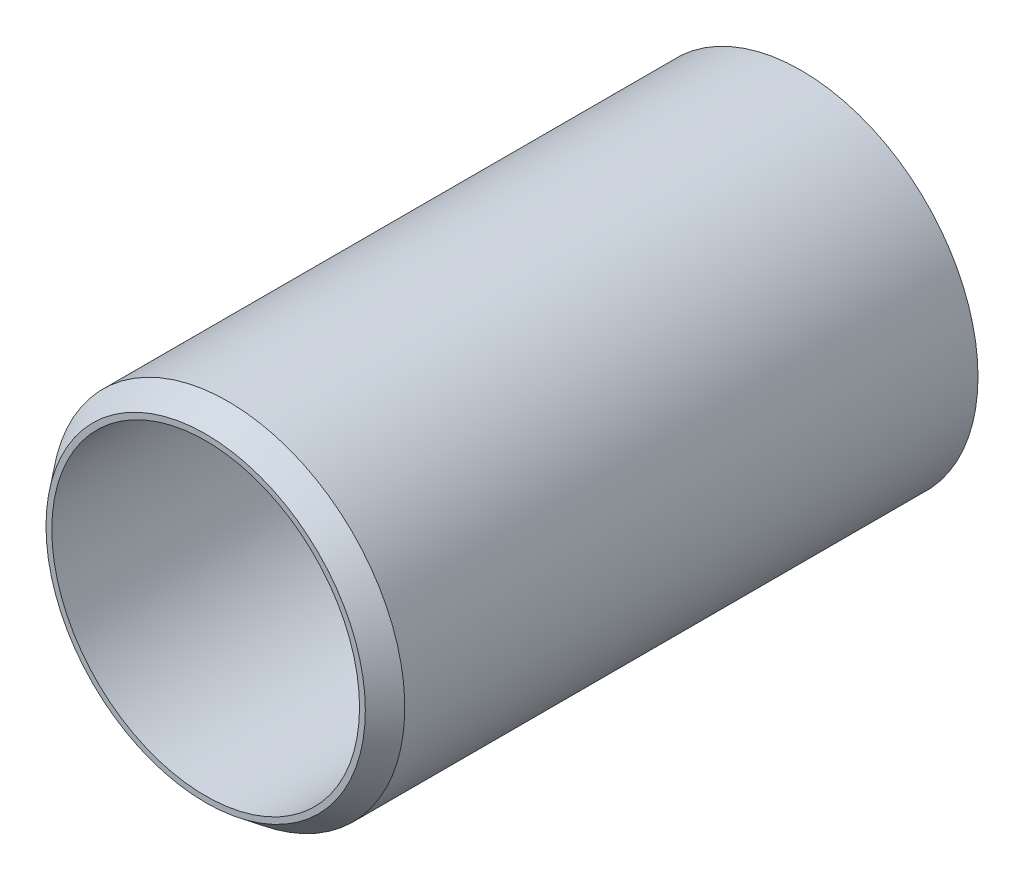
ISO-10303-21;
HEADER;
FILE_DESCRIPTION(('STEP AP214'),'2;1');
FILE_NAME('part.step','',(''),(''),'','','');
FILE_SCHEMA(('AUTOMOTIVE_DESIGN { 1 0 10303 214 1 1 1 1 }'));
ENDSEC;
DATA;
#1=APPLICATION_CONTEXT('core data for automotive mechanical design processes');
#2=APPLICATION_PROTOCOL_DEFINITION('international standard','automotive_design',2000,#1);
#3=PRODUCT_CONTEXT('',#1,'mechanical');
#4=PRODUCT('Part','Part','',(#3));
#5=PRODUCT_RELATED_PRODUCT_CATEGORY('part','',(#4));
#6=PRODUCT_DEFINITION_FORMATION('','',#4);
#7=PRODUCT_DEFINITION_CONTEXT('part definition',#1,'design');
#8=PRODUCT_DEFINITION('design','',#6,#7);
#9=PRODUCT_DEFINITION_SHAPE('','',#8);
#10=(LENGTH_UNIT() NAMED_UNIT(*) SI_UNIT(.MILLI.,.METRE.));
#11=(NAMED_UNIT(*) PLANE_ANGLE_UNIT() SI_UNIT($,.RADIAN.));
#12=(NAMED_UNIT(*) SI_UNIT($,.STERADIAN.) SOLID_ANGLE_UNIT());
#13=UNCERTAINTY_MEASURE_WITH_UNIT(LENGTH_MEASURE(1.E-05),#10,'distance_accuracy_value','');
#14=(GEOMETRIC_REPRESENTATION_CONTEXT(3) GLOBAL_UNCERTAINTY_ASSIGNED_CONTEXT((#13)) GLOBAL_UNIT_ASSIGNED_CONTEXT((#10,
#11,#12)) REPRESENTATION_CONTEXT('',''));
#15=CARTESIAN_POINT('',(0.,0.,0.));
#16=DIRECTION('',(0.,0.,1.));
#17=DIRECTION('',(1.,0.,0.));
#18=AXIS2_PLACEMENT_3D('',#15,#16,#17);
#19=CARTESIAN_POINT('',(0.,0.,50.8));
#20=DIRECTION('',(0.,0.,1.));
#21=DIRECTION('',(1.,0.,0.));
#22=AXIS2_PLACEMENT_3D('',#19,#20,#21);
#23=PLANE('',#22);
#24=CARTESIAN_POINT('',(0.,0.,50.8));
#25=DIRECTION('',(0.,0.,1.));
#26=DIRECTION('',(1.,0.,0.));
#27=AXIS2_PLACEMENT_3D('',#24,#25,#26);
#28=CIRCLE('',#27,27.2389841758002);
#29=CARTESIAN_POINT('',(-27.2389841758002,0.,50.8));
#30=VERTEX_POINT('',#29);
#31=EDGE_CURVE('E40',#30,#30,#28,.T.);
#32=ORIENTED_EDGE('',*,*,#31,.T.);
#33=EDGE_LOOP('',(#32));
#34=FACE_BOUND('',#33,.T.);
#35=CARTESIAN_POINT('',(0.,0.,50.8));
#36=DIRECTION('',(0.,0.,1.));
#37=DIRECTION('',(1.,0.,0.));
#38=AXIS2_PLACEMENT_3D('',#35,#36,#37);
#39=CIRCLE('',#38,26.2509);
#40=CARTESIAN_POINT('',(26.2509,0.,50.8));
#41=VERTEX_POINT('',#40);
#42=EDGE_CURVE('E48',#41,#41,#39,.T.);
#43=ORIENTED_EDGE('',*,*,#42,.F.);
#44=EDGE_LOOP('',(#43));
#45=FACE_BOUND('',#44,.T.);
#46=ADVANCED_FACE('F33',(#34,#45),#23,.T.);
#47=CARTESIAN_POINT('',(0.,0.,-50.8));
#48=DIRECTION('',(0.,0.,1.));
#49=DIRECTION('',(1.,0.,0.));
#50=AXIS2_PLACEMENT_3D('',#47,#48,#49);
#51=PLANE('',#50);
#52=CARTESIAN_POINT('',(0.,0.,-50.8));
#53=DIRECTION('',(0.,0.,1.));
#54=DIRECTION('',(1.,0.,0.));
#55=AXIS2_PLACEMENT_3D('',#52,#53,#54);
#56=CIRCLE('',#55,30.1625);
#57=CARTESIAN_POINT('',(30.1625,0.,-50.8));
#58=VERTEX_POINT('',#57);
#59=EDGE_CURVE('E44',#58,#58,#56,.T.);
#60=ORIENTED_EDGE('',*,*,#59,.F.);
#61=EDGE_LOOP('',(#60));
#62=FACE_BOUND('',#61,.T.);
#63=CARTESIAN_POINT('',(0.,0.,-50.8));
#64=DIRECTION('',(0.,0.,1.));
#65=DIRECTION('',(1.,0.,0.));
#66=AXIS2_PLACEMENT_3D('',#63,#64,#65);
#67=CIRCLE('',#66,26.2509);
#68=CARTESIAN_POINT('',(26.2509,0.,-50.8));
#69=VERTEX_POINT('',#68);
#70=EDGE_CURVE('E51',#69,#69,#67,.T.);
#71=ORIENTED_EDGE('',*,*,#70,.T.);
#72=EDGE_LOOP('',(#71));
#73=FACE_BOUND('',#72,.T.);
#74=ADVANCED_FACE('F61',(#62,#73),#51,.F.);
#75=CARTESIAN_POINT('',(0.,0.,50.8));
#76=DIRECTION('',(0.,0.,-1.));
#77=DIRECTION('',(-1.,0.,0.));
#78=AXIS2_PLACEMENT_3D('',#75,#76,#77);
#79=CYLINDRICAL_SURFACE('',#78,30.1625);
#80=CARTESIAN_POINT('',(0.,0.,46.99));
#81=DIRECTION('',(0.,0.,1.));
#82=DIRECTION('',(1.,0.,0.));
#83=AXIS2_PLACEMENT_3D('',#80,#81,#82);
#84=CIRCLE('',#83,30.1625);
#85=CARTESIAN_POINT('',(-30.1625,0.,46.99));
#86=VERTEX_POINT('',#85);
#87=EDGE_CURVE('E10',#86,#86,#84,.F.);
#88=ORIENTED_EDGE('',*,*,#87,.T.);
#89=EDGE_LOOP('',(#88));
#90=FACE_BOUND('',#89,.T.);
#91=ORIENTED_EDGE('',*,*,#59,.T.);
#92=EDGE_LOOP('',(#91));
#93=FACE_BOUND('',#92,.T.);
#94=ADVANCED_FACE('F66',(#90,#93),#79,.T.);
#95=CARTESIAN_POINT('',(0.,0.,50.8));
#96=DIRECTION('',(0.,0.,-1.));
#97=DIRECTION('',(-1.,0.,0.));
#98=AXIS2_PLACEMENT_3D('',#95,#96,#97);
#99=CYLINDRICAL_SURFACE('',#98,26.2509);
#100=ORIENTED_EDGE('',*,*,#42,.T.);
#101=EDGE_LOOP('',(#100));
#102=FACE_BOUND('',#101,.T.);
#103=ORIENTED_EDGE('',*,*,#70,.F.);
#104=EDGE_LOOP('',(#103));
#105=FACE_BOUND('',#104,.T.);
#106=ADVANCED_FACE('F57',(#102,#105),#99,.F.);
#107=CARTESIAN_POINT('',(0.,0.,50.8));
#108=DIRECTION('',(0.,0.,-1.));
#109=DIRECTION('',(-1.,0.,0.));
#110=AXIS2_PLACEMENT_3D('',#107,#108,#109);
#111=CONICAL_SURFACE('',#110,27.2389841758002,0.654498469497871);
#112=CARTESIAN_POINT('',(-30.1625,0.,46.99));
#113=CARTESIAN_POINT('',(-30.1320467101646,0.,47.0296875));
#114=CARTESIAN_POINT('',(-30.1015934203292,0.,47.069375));
#115=CARTESIAN_POINT('',(-30.0406868406583,0.,47.14875));
#116=CARTESIAN_POINT('',(-30.0102335508229,0.,47.1884375));
#117=CARTESIAN_POINT('',(-29.9493269711521,0.,47.2678125));
#118=CARTESIAN_POINT('',(-29.9188736813167,0.,47.3075));
#119=CARTESIAN_POINT('',(-29.8579671016459,0.,47.386875));
#120=CARTESIAN_POINT('',(-29.8275138118104,0.,47.4265625));
#121=CARTESIAN_POINT('',(-29.7666072321396,0.,47.5059375));
#122=CARTESIAN_POINT('',(-29.7361539423042,0.,47.545625));
#123=CARTESIAN_POINT('',(-29.6752473626334,0.,47.625));
#124=CARTESIAN_POINT('',(-29.6447940727979,0.,47.6646875));
#125=CARTESIAN_POINT('',(-29.5838874931271,0.,47.7440625));
#126=CARTESIAN_POINT('',(-29.5534342032917,0.,47.78375));
#127=CARTESIAN_POINT('',(-29.4925276236209,0.,47.863125));
#128=CARTESIAN_POINT('',(-29.4620743337855,0.,47.9028125));
#129=CARTESIAN_POINT('',(-29.4011677541146,0.,47.9821875));
#130=CARTESIAN_POINT('',(-29.3707144642792,0.,48.021875));
#131=CARTESIAN_POINT('',(-29.3098078846084,0.,48.10125));
#132=CARTESIAN_POINT('',(-29.279354594773,0.,48.1409375));
#133=CARTESIAN_POINT('',(-29.2184480151021,0.,48.2203125));
#134=CARTESIAN_POINT('',(-29.1879947252667,0.,48.26));
#135=CARTESIAN_POINT('',(-29.1270881455959,0.,48.339375));
#136=CARTESIAN_POINT('',(-29.0966348557605,0.,48.3790625));
#137=CARTESIAN_POINT('',(-29.0357282760897,0.,48.4584375));
#138=CARTESIAN_POINT('',(-29.0052749862542,0.,48.498125));
#139=CARTESIAN_POINT('',(-28.9443684065834,0.,48.5775));
#140=CARTESIAN_POINT('',(-28.913915116748,0.,48.6171875));
#141=CARTESIAN_POINT('',(-28.8530085370772,0.,48.6965625));
#142=CARTESIAN_POINT('',(-28.8225552472418,0.,48.73625));
#143=CARTESIAN_POINT('',(-28.7616486675709,0.,48.815625));
#144=CARTESIAN_POINT('',(-28.7311953777355,0.,48.8553125));
#145=CARTESIAN_POINT('',(-28.6702887980647,0.,48.9346875));
#146=CARTESIAN_POINT('',(-28.6398355082293,0.,48.974375));
#147=CARTESIAN_POINT('',(-28.5789289285584,0.,49.05375));
#148=CARTESIAN_POINT('',(-28.548475638723,0.,49.0934375));
#149=CARTESIAN_POINT('',(-28.4875690590522,0.,49.1728125));
#150=CARTESIAN_POINT('',(-28.4571157692168,0.,49.2125));
#151=CARTESIAN_POINT('',(-28.3962091895459,0.,49.291875));
#152=CARTESIAN_POINT('',(-28.3657558997105,0.,49.3315625));
#153=CARTESIAN_POINT('',(-28.3048493200397,0.,49.4109375));
#154=CARTESIAN_POINT('',(-28.2743960302043,0.,49.450625));
#155=CARTESIAN_POINT('',(-28.2134894505335,0.,49.53));
#156=CARTESIAN_POINT('',(-28.183036160698,0.,49.5696875));
#157=CARTESIAN_POINT('',(-28.1221295810272,0.,49.6490625));
#158=CARTESIAN_POINT('',(-28.0916762911918,0.,49.68875));
#159=CARTESIAN_POINT('',(-28.030769711521,0.,49.768125));
#160=CARTESIAN_POINT('',(-28.0003164216855,0.,49.8078125));
#161=CARTESIAN_POINT('',(-27.9394098420147,0.,49.8871875));
#162=CARTESIAN_POINT('',(-27.9089565521793,0.,49.926875));
#163=CARTESIAN_POINT('',(-27.8480499725085,0.,50.00625));
#164=CARTESIAN_POINT('',(-27.8175966826731,0.,50.0459375));
#165=CARTESIAN_POINT('',(-27.7566901030022,0.,50.1253125));
#166=CARTESIAN_POINT('',(-27.7262368131668,0.,50.165));
#167=CARTESIAN_POINT('',(-27.665330233496,0.,50.244375));
#168=CARTESIAN_POINT('',(-27.6348769436606,0.,50.2840625));
#169=CARTESIAN_POINT('',(-27.5739703639897,0.,50.3634375));
#170=CARTESIAN_POINT('',(-27.5435170741543,0.,50.403125));
#171=CARTESIAN_POINT('',(-27.4826104944835,0.,50.4825));
#172=CARTESIAN_POINT('',(-27.4521572046481,0.,50.5221875));
#173=CARTESIAN_POINT('',(-27.3912506249772,0.,50.6015625));
#174=CARTESIAN_POINT('',(-27.3607973351418,0.,50.64125));
#175=CARTESIAN_POINT('',(-27.299890755471,0.,50.720625));
#176=CARTESIAN_POINT('',(-27.2694374656356,0.,50.7603125));
#177=CARTESIAN_POINT('',(-27.2389841758002,0.,50.8));
#178=B_SPLINE_CURVE_WITH_KNOTS('',3,(#112,#113,#114,#115,#116,#117,#118,#119,#120,#121,#122,
#123,#124,#125,#126,#127,#128,#129,#130,#131,#132,#133,#134,#135,#136,#137,#138,#139,#140,#141,
#142,#143,#144,#145,#146,#147,#148,#149,#150,#151,#152,#153,#154,#155,#156,#157,#158,#159,#160,
#161,#162,#163,#164,#165,#166,#167,#168,#169,#170,#171,#172,#173,#174,#175,#176,#177),
.UNSPECIFIED.,.F.,.F.,(4,2,2,2,2,2,2,2,2,2,2,2,2,2,2,2,2,2,2,2,2,2,2,2,2,2,2,2,2,2,2,2,4),(0.,
0.150074996793099,0.300149993586198,0.450224990379293,0.600299987172392,0.75037498396549,
0.900449980758584,1.05052497755168,1.20059997434478,1.35067497113788,1.50074996793098,
1.65082496472407,1.80089996151717,1.95097495831027,2.10104995510336,2.25112495189646,
2.40119994868955,2.55127494548265,2.70134994227575,2.85142493906885,3.00149993586194,
3.15157493265504,3.30164992944814,3.45172492624124,3.60179992303434,3.75187491982743,
3.90194991662053,4.05202491341362,4.20209991020672,4.35217490699982,4.50224990379291,
4.65232490058601,4.80239989737911),.UNSPECIFIED.);
#179=EDGE_CURVE('BSEAM35',#86,#30,#178,.T.);
#180=ORIENTED_EDGE('',*,*,#87,.F.);
#181=ORIENTED_EDGE('',*,*,#31,.F.);
#182=ORIENTED_EDGE('',*,*,#179,.T.);
#183=ORIENTED_EDGE('',*,*,#179,.F.);
#184=EDGE_LOOP('',(#180,#182,#181,#183));
#185=FACE_BOUND('',#184,.T.);
#186=ADVANCED_FACE('F35',(#185),#111,.T.);
#187=CLOSED_SHELL('',(#46,#74,#94,#106,#186));
#188=MANIFOLD_SOLID_BREP('B2',#187);
#189=ADVANCED_BREP_SHAPE_REPRESENTATION('',(#18,#188),#14);
#190=SHAPE_DEFINITION_REPRESENTATION(#9,#189);
ENDSEC;
END-ISO-10303-21;
